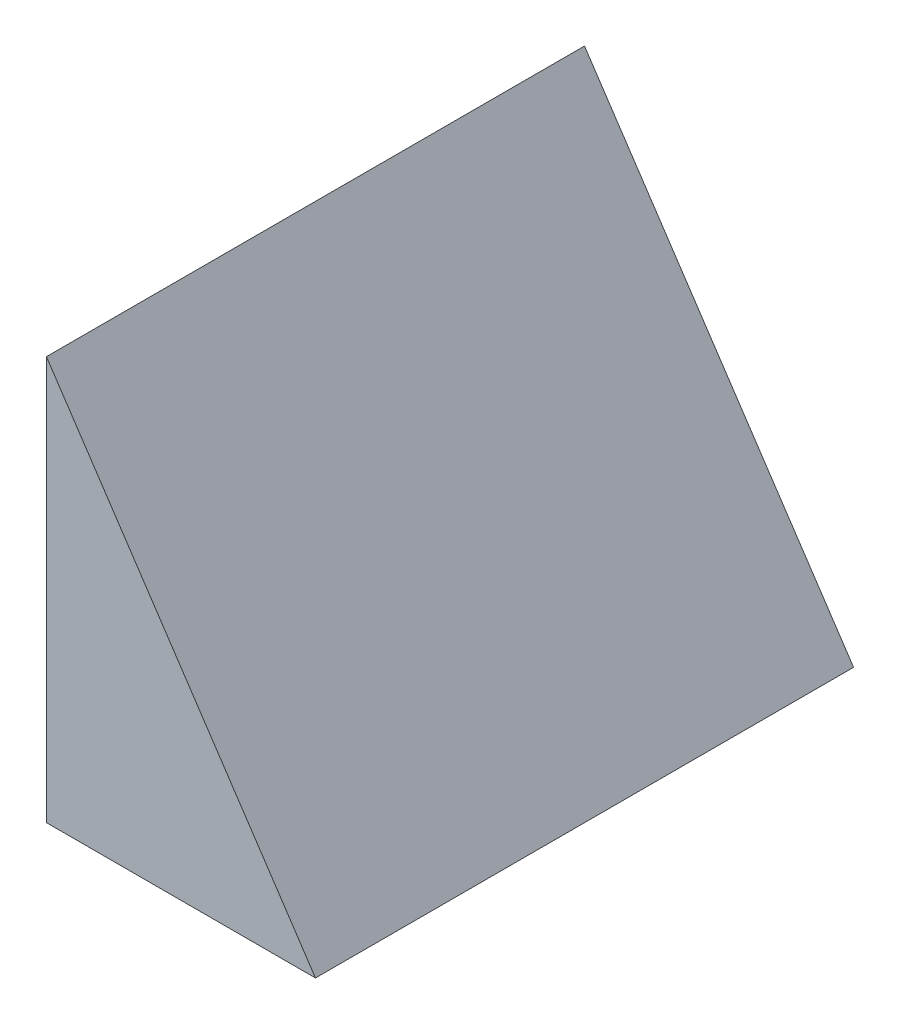
ISO-10303-21;
HEADER;
FILE_DESCRIPTION(('STEP AP214'),'2;1');
FILE_NAME('part.step','',(''),(''),'','','');
FILE_SCHEMA(('AUTOMOTIVE_DESIGN { 1 0 10303 214 1 1 1 1 }'));
ENDSEC;
DATA;
#1=APPLICATION_CONTEXT('core data for automotive mechanical design processes');
#2=APPLICATION_PROTOCOL_DEFINITION('international standard','automotive_design',2000,#1);
#3=PRODUCT_CONTEXT('',#1,'mechanical');
#4=PRODUCT('Part','Part','',(#3));
#5=PRODUCT_RELATED_PRODUCT_CATEGORY('part','',(#4));
#6=PRODUCT_DEFINITION_FORMATION('','',#4);
#7=PRODUCT_DEFINITION_CONTEXT('part definition',#1,'design');
#8=PRODUCT_DEFINITION('design','',#6,#7);
#9=PRODUCT_DEFINITION_SHAPE('','',#8);
#10=(LENGTH_UNIT() NAMED_UNIT(*) SI_UNIT(.MILLI.,.METRE.));
#11=(NAMED_UNIT(*) PLANE_ANGLE_UNIT() SI_UNIT($,.RADIAN.));
#12=(NAMED_UNIT(*) SI_UNIT($,.STERADIAN.) SOLID_ANGLE_UNIT());
#13=UNCERTAINTY_MEASURE_WITH_UNIT(LENGTH_MEASURE(1.E-05),#10,'distance_accuracy_value','');
#14=(GEOMETRIC_REPRESENTATION_CONTEXT(3) GLOBAL_UNCERTAINTY_ASSIGNED_CONTEXT((#13)) GLOBAL_UNIT_ASSIGNED_CONTEXT((#10,
#11,#12)) REPRESENTATION_CONTEXT('',''));
#15=CARTESIAN_POINT('',(0.,0.,0.));
#16=DIRECTION('',(0.,0.,1.));
#17=DIRECTION('',(1.,0.,0.));
#18=AXIS2_PLACEMENT_3D('',#15,#16,#17);
#19=CARTESIAN_POINT('',(0.,15.,20.));
#20=DIRECTION('',(1.,0.,0.));
#21=DIRECTION('',(0.,1.,0.));
#22=AXIS2_PLACEMENT_3D('',#19,#20,#21);
#23=PLANE('',#22);
#24=DIRECTION('',(0.,-1.,0.));
#25=VECTOR('',#24,1.);
#26=CARTESIAN_POINT('',(0.,15.,0.));
#27=LINE('',#26,#25);
#28=CARTESIAN_POINT('',(0.,15.,0.));
#29=VERTEX_POINT('',#28);
#30=CARTESIAN_POINT('',(0.,0.,0.));
#31=VERTEX_POINT('',#30);
#32=EDGE_CURVE('E86',#29,#31,#27,.T.);
#33=ORIENTED_EDGE('',*,*,#32,.T.);
#34=DIRECTION('',(0.,0.,-1.));
#35=VECTOR('',#34,1.);
#36=CARTESIAN_POINT('',(0.,0.,20.));
#37=LINE('',#36,#35);
#38=CARTESIAN_POINT('',(0.,0.,20.));
#39=VERTEX_POINT('',#38);
#40=EDGE_CURVE('E11',#39,#31,#37,.T.);
#41=ORIENTED_EDGE('',*,*,#40,.F.);
#42=DIRECTION('',(0.,-1.,0.));
#43=VECTOR('',#42,1.);
#44=CARTESIAN_POINT('',(0.,15.,20.));
#45=LINE('',#44,#43);
#46=CARTESIAN_POINT('',(0.,15.,20.));
#47=VERTEX_POINT('',#46);
#48=EDGE_CURVE('E79',#47,#39,#45,.T.);
#49=ORIENTED_EDGE('',*,*,#48,.F.);
#50=DIRECTION('',(0.,0.,-1.));
#51=VECTOR('',#50,1.);
#52=CARTESIAN_POINT('',(0.,15.,20.));
#53=LINE('',#52,#51);
#54=EDGE_CURVE('E87',#47,#29,#53,.T.);
#55=ORIENTED_EDGE('',*,*,#54,.T.);
#56=EDGE_LOOP('',(#33,#41,#49,#55));
#57=FACE_BOUND('',#56,.T.);
#58=ADVANCED_FACE('F39',(#57),#23,.F.);
#59=CARTESIAN_POINT('',(0.,0.,20.));
#60=DIRECTION('',(0.,1.,0.));
#61=DIRECTION('',(0.,0.,1.));
#62=AXIS2_PLACEMENT_3D('',#59,#60,#61);
#63=PLANE('',#62);
#64=DIRECTION('',(1.,0.,0.));
#65=VECTOR('',#64,1.);
#66=CARTESIAN_POINT('',(0.,0.,0.));
#67=LINE('',#66,#65);
#68=CARTESIAN_POINT('',(10.,0.,0.));
#69=VERTEX_POINT('',#68);
#70=EDGE_CURVE('E67',#31,#69,#67,.T.);
#71=ORIENTED_EDGE('',*,*,#70,.T.);
#72=DIRECTION('',(0.,0.,-1.));
#73=VECTOR('',#72,1.);
#74=CARTESIAN_POINT('',(10.,0.,20.));
#75=LINE('',#74,#73);
#76=CARTESIAN_POINT('',(10.,0.,20.));
#77=VERTEX_POINT('',#76);
#78=EDGE_CURVE('E47',#77,#69,#75,.T.);
#79=ORIENTED_EDGE('',*,*,#78,.F.);
#80=DIRECTION('',(1.,0.,0.));
#81=VECTOR('',#80,1.);
#82=CARTESIAN_POINT('',(0.,0.,20.));
#83=LINE('',#82,#81);
#84=EDGE_CURVE('E75',#39,#77,#83,.T.);
#85=ORIENTED_EDGE('',*,*,#84,.F.);
#86=ORIENTED_EDGE('',*,*,#40,.T.);
#87=EDGE_LOOP('',(#71,#79,#85,#86));
#88=FACE_BOUND('',#87,.T.);
#89=ADVANCED_FACE('F76',(#88),#63,.F.);
#90=CARTESIAN_POINT('',(10.,0.,20.));
#91=DIRECTION('',(-0.832050294337844,-0.554700196225229,0.));
#92=DIRECTION('',(0.554700196225229,-0.832050294337844,0.));
#93=AXIS2_PLACEMENT_3D('',#90,#91,#92);
#94=PLANE('',#93);
#95=DIRECTION('',(-0.554700196225229,0.832050294337844,0.));
#96=VECTOR('',#95,1.);
#97=CARTESIAN_POINT('',(10.,0.,0.));
#98=LINE('',#97,#96);
#99=EDGE_CURVE('E72',#69,#29,#98,.T.);
#100=ORIENTED_EDGE('',*,*,#99,.T.);
#101=ORIENTED_EDGE('',*,*,#54,.F.);
#102=DIRECTION('',(-0.554700196225229,0.832050294337844,0.));
#103=VECTOR('',#102,1.);
#104=CARTESIAN_POINT('',(10.,0.,20.));
#105=LINE('',#104,#103);
#106=EDGE_CURVE('E55',#77,#47,#105,.T.);
#107=ORIENTED_EDGE('',*,*,#106,.F.);
#108=ORIENTED_EDGE('',*,*,#78,.T.);
#109=EDGE_LOOP('',(#100,#101,#107,#108));
#110=FACE_BOUND('',#109,.T.);
#111=ADVANCED_FACE('F94',(#110),#94,.F.);
#112=CARTESIAN_POINT('',(0.,0.,20.));
#113=DIRECTION('',(0.,0.,1.));
#114=DIRECTION('',(1.,0.,0.));
#115=AXIS2_PLACEMENT_3D('',#112,#113,#114);
#116=PLANE('',#115);
#117=ORIENTED_EDGE('',*,*,#48,.T.);
#118=ORIENTED_EDGE('',*,*,#84,.T.);
#119=ORIENTED_EDGE('',*,*,#106,.T.);
#120=EDGE_LOOP('',(#117,#118,#119));
#121=FACE_BOUND('',#120,.T.);
#122=ADVANCED_FACE('F82',(#121),#116,.T.);
#123=CARTESIAN_POINT('',(0.,0.,0.));
#124=DIRECTION('',(0.,0.,1.));
#125=DIRECTION('',(1.,0.,0.));
#126=AXIS2_PLACEMENT_3D('',#123,#124,#125);
#127=PLANE('',#126);
#128=ORIENTED_EDGE('',*,*,#32,.F.);
#129=ORIENTED_EDGE('',*,*,#99,.F.);
#130=ORIENTED_EDGE('',*,*,#70,.F.);
#131=EDGE_LOOP('',(#128,#129,#130));
#132=FACE_BOUND('',#131,.T.);
#133=ADVANCED_FACE('F95',(#132),#127,.F.);
#134=CLOSED_SHELL('',(#58,#89,#111,#122,#133));
#135=MANIFOLD_SOLID_BREP('B2',#134);
#136=ADVANCED_BREP_SHAPE_REPRESENTATION('',(#18,#135),#14);
#137=SHAPE_DEFINITION_REPRESENTATION(#9,#136);
ENDSEC;
END-ISO-10303-21;
